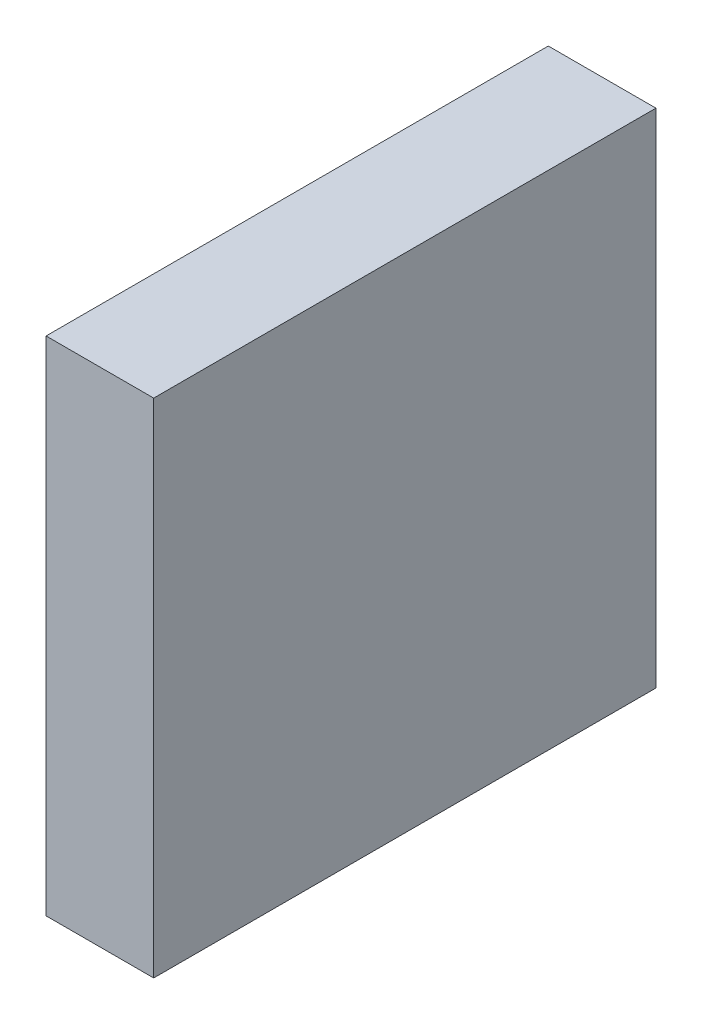
ISO-10303-21;
HEADER;
FILE_DESCRIPTION(('STEP AP214'),'2;1');
FILE_NAME('part.step','',(''),(''),'','','');
FILE_SCHEMA(('AUTOMOTIVE_DESIGN { 1 0 10303 214 1 1 1 1 }'));
ENDSEC;
DATA;
#1=APPLICATION_CONTEXT('core data for automotive mechanical design processes');
#2=APPLICATION_PROTOCOL_DEFINITION('international standard','automotive_design',2000,#1);
#3=PRODUCT_CONTEXT('',#1,'mechanical');
#4=PRODUCT('Part','Part','',(#3));
#5=PRODUCT_RELATED_PRODUCT_CATEGORY('part','',(#4));
#6=PRODUCT_DEFINITION_FORMATION('','',#4);
#7=PRODUCT_DEFINITION_CONTEXT('part definition',#1,'design');
#8=PRODUCT_DEFINITION('design','',#6,#7);
#9=PRODUCT_DEFINITION_SHAPE('','',#8);
#10=(LENGTH_UNIT() NAMED_UNIT(*) SI_UNIT(.MILLI.,.METRE.));
#11=(NAMED_UNIT(*) PLANE_ANGLE_UNIT() SI_UNIT($,.RADIAN.));
#12=(NAMED_UNIT(*) SI_UNIT($,.STERADIAN.) SOLID_ANGLE_UNIT());
#13=UNCERTAINTY_MEASURE_WITH_UNIT(LENGTH_MEASURE(1.E-05),#10,'distance_accuracy_value','');
#14=(GEOMETRIC_REPRESENTATION_CONTEXT(3) GLOBAL_UNCERTAINTY_ASSIGNED_CONTEXT((#13)) GLOBAL_UNIT_ASSIGNED_CONTEXT((#10,
#11,#12)) REPRESENTATION_CONTEXT('',''));
#15=CARTESIAN_POINT('',(0.,0.,0.));
#16=DIRECTION('',(0.,0.,1.));
#17=DIRECTION('',(1.,0.,0.));
#18=AXIS2_PLACEMENT_3D('',#15,#16,#17);
#19=CARTESIAN_POINT('',(172.5,1180.,-470.));
#20=DIRECTION('',(-1.,0.,0.));
#21=DIRECTION('',(0.,0.,1.));
#22=AXIS2_PLACEMENT_3D('',#19,#20,#21);
#23=PLANE('',#22);
#24=DIRECTION('',(0.,-1.,0.));
#25=VECTOR('',#24,1.);
#26=CARTESIAN_POINT('',(172.5,1180.,-330.));
#27=LINE('',#26,#25);
#28=CARTESIAN_POINT('',(172.5,1320.,-330.));
#29=VERTEX_POINT('',#28);
#30=CARTESIAN_POINT('',(172.5,1180.,-330.));
#31=VERTEX_POINT('',#30);
#32=EDGE_CURVE('E103',#29,#31,#27,.T.);
#33=ORIENTED_EDGE('',*,*,#32,.F.);
#34=DIRECTION('',(0.,0.,1.));
#35=VECTOR('',#34,1.);
#36=CARTESIAN_POINT('',(172.5,1320.,-470.));
#37=LINE('',#36,#35);
#38=CARTESIAN_POINT('',(172.5,1320.,-470.));
#39=VERTEX_POINT('',#38);
#40=EDGE_CURVE('E11',#39,#29,#37,.T.);
#41=ORIENTED_EDGE('',*,*,#40,.F.);
#42=DIRECTION('',(0.,-1.,0.));
#43=VECTOR('',#42,1.);
#44=CARTESIAN_POINT('',(172.5,1180.,-470.));
#45=LINE('',#44,#43);
#46=CARTESIAN_POINT('',(172.5,1180.,-470.));
#47=VERTEX_POINT('',#46);
#48=EDGE_CURVE('E97',#39,#47,#45,.T.);
#49=ORIENTED_EDGE('',*,*,#48,.T.);
#50=DIRECTION('',(0.,0.,1.));
#51=VECTOR('',#50,1.);
#52=CARTESIAN_POINT('',(172.5,1180.,-470.));
#53=LINE('',#52,#51);
#54=EDGE_CURVE('E42',#47,#31,#53,.T.);
#55=ORIENTED_EDGE('',*,*,#54,.T.);
#56=EDGE_LOOP('',(#33,#41,#49,#55));
#57=FACE_BOUND('',#56,.T.);
#58=ADVANCED_FACE('F39',(#57),#23,.T.);
#59=CARTESIAN_POINT('',(172.5,1320.,-470.));
#60=DIRECTION('',(0.,1.,0.));
#61=DIRECTION('',(0.,0.,1.));
#62=AXIS2_PLACEMENT_3D('',#59,#60,#61);
#63=PLANE('',#62);
#64=DIRECTION('',(-1.,0.,0.));
#65=VECTOR('',#64,1.);
#66=CARTESIAN_POINT('',(172.5,1320.,-330.));
#67=LINE('',#66,#65);
#68=CARTESIAN_POINT('',(202.5,1320.,-330.));
#69=VERTEX_POINT('',#68);
#70=EDGE_CURVE('E99',#69,#29,#67,.T.);
#71=ORIENTED_EDGE('',*,*,#70,.F.);
#72=DIRECTION('',(0.,0.,1.));
#73=VECTOR('',#72,1.);
#74=CARTESIAN_POINT('',(202.5,1320.,-470.));
#75=LINE('',#74,#73);
#76=CARTESIAN_POINT('',(202.5,1320.,-470.));
#77=VERTEX_POINT('',#76);
#78=EDGE_CURVE('E48',#77,#69,#75,.T.);
#79=ORIENTED_EDGE('',*,*,#78,.F.);
#80=DIRECTION('',(-1.,0.,0.));
#81=VECTOR('',#80,1.);
#82=CARTESIAN_POINT('',(172.5,1320.,-470.));
#83=LINE('',#82,#81);
#84=EDGE_CURVE('E94',#77,#39,#83,.T.);
#85=ORIENTED_EDGE('',*,*,#84,.T.);
#86=ORIENTED_EDGE('',*,*,#40,.T.);
#87=EDGE_LOOP('',(#71,#79,#85,#86));
#88=FACE_BOUND('',#87,.T.);
#89=ADVANCED_FACE('F113',(#88),#63,.T.);
#90=CARTESIAN_POINT('',(202.5,1180.,-470.));
#91=DIRECTION('',(1.,0.,0.));
#92=DIRECTION('',(0.,0.,-1.));
#93=AXIS2_PLACEMENT_3D('',#90,#91,#92);
#94=PLANE('',#93);
#95=DIRECTION('',(0.,1.,0.));
#96=VECTOR('',#95,1.);
#97=CARTESIAN_POINT('',(202.5,1180.,-330.));
#98=LINE('',#97,#96);
#99=CARTESIAN_POINT('',(202.5,1180.,-330.));
#100=VERTEX_POINT('',#99);
#101=EDGE_CURVE('E89',#100,#69,#98,.T.);
#102=ORIENTED_EDGE('',*,*,#101,.F.);
#103=DIRECTION('',(0.,0.,1.));
#104=VECTOR('',#103,1.);
#105=CARTESIAN_POINT('',(202.5,1180.,-470.));
#106=LINE('',#105,#104);
#107=CARTESIAN_POINT('',(202.5,1180.,-470.));
#108=VERTEX_POINT('',#107);
#109=EDGE_CURVE('E84',#108,#100,#106,.T.);
#110=ORIENTED_EDGE('',*,*,#109,.F.);
#111=DIRECTION('',(0.,1.,0.));
#112=VECTOR('',#111,1.);
#113=CARTESIAN_POINT('',(202.5,1180.,-470.));
#114=LINE('',#113,#112);
#115=EDGE_CURVE('E87',#108,#77,#114,.T.);
#116=ORIENTED_EDGE('',*,*,#115,.T.);
#117=ORIENTED_EDGE('',*,*,#78,.T.);
#118=EDGE_LOOP('',(#102,#110,#116,#117));
#119=FACE_BOUND('',#118,.T.);
#120=ADVANCED_FACE('F86',(#119),#94,.T.);
#121=CARTESIAN_POINT('',(172.5,1180.,-470.));
#122=DIRECTION('',(0.,-1.,0.));
#123=DIRECTION('',(0.,0.,-1.));
#124=AXIS2_PLACEMENT_3D('',#121,#122,#123);
#125=PLANE('',#124);
#126=DIRECTION('',(1.,0.,0.));
#127=VECTOR('',#126,1.);
#128=CARTESIAN_POINT('',(172.5,1180.,-330.));
#129=LINE('',#128,#127);
#130=EDGE_CURVE('E106',#31,#100,#129,.T.);
#131=ORIENTED_EDGE('',*,*,#130,.F.);
#132=ORIENTED_EDGE('',*,*,#54,.F.);
#133=DIRECTION('',(1.,0.,0.));
#134=VECTOR('',#133,1.);
#135=CARTESIAN_POINT('',(172.5,1180.,-470.));
#136=LINE('',#135,#134);
#137=EDGE_CURVE('E93',#47,#108,#136,.T.);
#138=ORIENTED_EDGE('',*,*,#137,.T.);
#139=ORIENTED_EDGE('',*,*,#109,.T.);
#140=EDGE_LOOP('',(#131,#132,#138,#139));
#141=FACE_BOUND('',#140,.T.);
#142=ADVANCED_FACE('F96',(#141),#125,.T.);
#143=CARTESIAN_POINT('',(0.,0.,-470.));
#144=DIRECTION('',(0.,0.,-1.));
#145=DIRECTION('',(-1.,0.,0.));
#146=AXIS2_PLACEMENT_3D('',#143,#144,#145);
#147=PLANE('',#146);
#148=ORIENTED_EDGE('',*,*,#48,.F.);
#149=ORIENTED_EDGE('',*,*,#84,.F.);
#150=ORIENTED_EDGE('',*,*,#115,.F.);
#151=ORIENTED_EDGE('',*,*,#137,.F.);
#152=EDGE_LOOP('',(#148,#149,#150,#151));
#153=FACE_BOUND('',#152,.T.);
#154=ADVANCED_FACE('F92',(#153),#147,.T.);
#155=CARTESIAN_POINT('',(0.,0.,-330.));
#156=DIRECTION('',(0.,0.,-1.));
#157=DIRECTION('',(-1.,0.,0.));
#158=AXIS2_PLACEMENT_3D('',#155,#156,#157);
#159=PLANE('',#158);
#160=ORIENTED_EDGE('',*,*,#32,.T.);
#161=ORIENTED_EDGE('',*,*,#130,.T.);
#162=ORIENTED_EDGE('',*,*,#101,.T.);
#163=ORIENTED_EDGE('',*,*,#70,.T.);
#164=EDGE_LOOP('',(#160,#161,#162,#163));
#165=FACE_BOUND('',#164,.T.);
#166=ADVANCED_FACE('F112',(#165),#159,.F.);
#167=CLOSED_SHELL('',(#58,#89,#120,#142,#154,#166));
#168=MANIFOLD_SOLID_BREP('B2',#167);
#169=ADVANCED_BREP_SHAPE_REPRESENTATION('',(#18,#168),#14);
#170=SHAPE_DEFINITION_REPRESENTATION(#9,#169);
ENDSEC;
END-ISO-10303-21;
